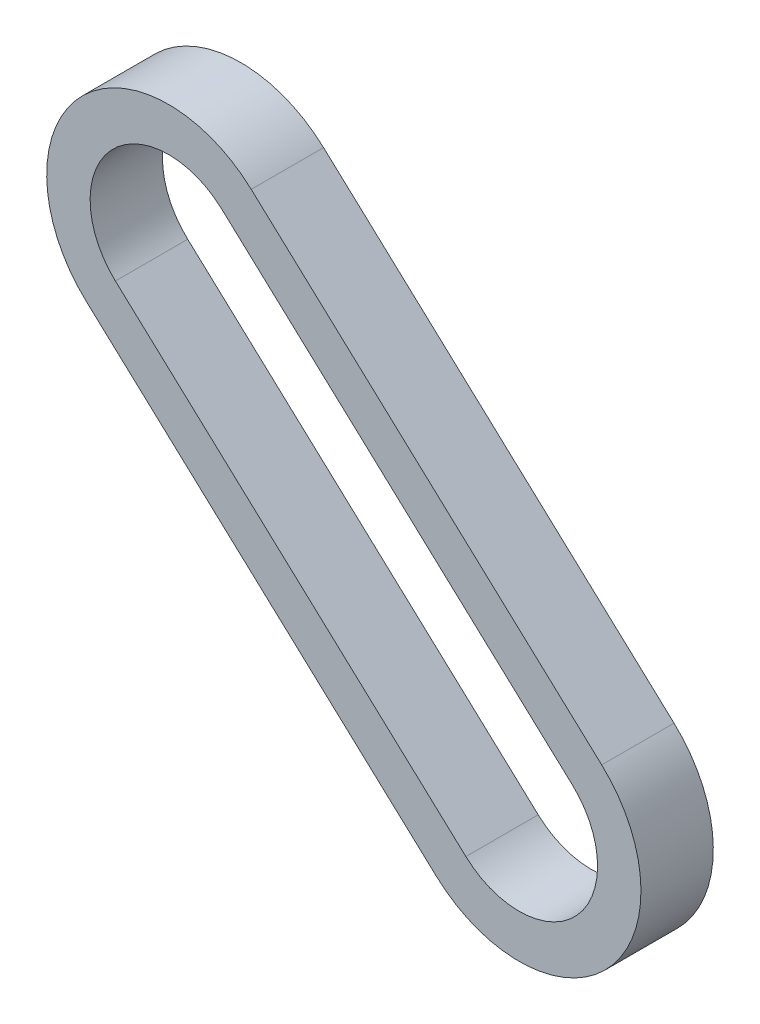
ISO-10303-21;
HEADER;
FILE_DESCRIPTION(('STEP AP214'),'2;1');
FILE_NAME('part.step','',(''),(''),'','','');
FILE_SCHEMA(('AUTOMOTIVE_DESIGN { 1 0 10303 214 1 1 1 1 }'));
ENDSEC;
DATA;
#1=APPLICATION_CONTEXT('core data for automotive mechanical design processes');
#2=APPLICATION_PROTOCOL_DEFINITION('international standard','automotive_design',2000,#1);
#3=PRODUCT_CONTEXT('',#1,'mechanical');
#4=PRODUCT('Part','Part','',(#3));
#5=PRODUCT_RELATED_PRODUCT_CATEGORY('part','',(#4));
#6=PRODUCT_DEFINITION_FORMATION('','',#4);
#7=PRODUCT_DEFINITION_CONTEXT('part definition',#1,'design');
#8=PRODUCT_DEFINITION('design','',#6,#7);
#9=PRODUCT_DEFINITION_SHAPE('','',#8);
#10=(LENGTH_UNIT() NAMED_UNIT(*) SI_UNIT(.MILLI.,.METRE.));
#11=(NAMED_UNIT(*) PLANE_ANGLE_UNIT() SI_UNIT($,.RADIAN.));
#12=(NAMED_UNIT(*) SI_UNIT($,.STERADIAN.) SOLID_ANGLE_UNIT());
#13=UNCERTAINTY_MEASURE_WITH_UNIT(LENGTH_MEASURE(1.E-05),#10,'distance_accuracy_value','');
#14=(GEOMETRIC_REPRESENTATION_CONTEXT(3) GLOBAL_UNCERTAINTY_ASSIGNED_CONTEXT((#13)) GLOBAL_UNIT_ASSIGNED_CONTEXT((#10,
#11,#12)) REPRESENTATION_CONTEXT('',''));
#15=CARTESIAN_POINT('',(0.,0.,0.));
#16=DIRECTION('',(0.,0.,1.));
#17=DIRECTION('',(1.,0.,0.));
#18=AXIS2_PLACEMENT_3D('',#15,#16,#17);
#19=CARTESIAN_POINT('',(7.48752404025904,-6.94681154311487,10.));
#20=DIRECTION('',(0.,0.,-1.));
#21=DIRECTION('',(-1.,0.,0.));
#22=AXIS2_PLACEMENT_3D('',#19,#20,#21);
#23=PLANE('',#22);
#24=CARTESIAN_POINT('',(7.48752404025904,-6.94681154311487,10.));
#25=DIRECTION('',(0.,0.,-1.));
#26=DIRECTION('',(-1.,0.,0.));
#27=AXIS2_PLACEMENT_3D('',#24,#25,#26);
#28=CIRCLE('',#27,16.85);
#29=CARTESIAN_POINT('',(-3.9353253675517,-19.3339424218324,10.));
#30=VERTEX_POINT('',#29);
#31=CARTESIAN_POINT('',(18.9103734480698,5.44031933560267,10.));
#32=VERTEX_POINT('',#31);
#33=EDGE_CURVE('E162',#30,#32,#28,.F.);
#34=ORIENTED_EDGE('',*,*,#33,.T.);
#35=DIRECTION('',(-0.73514129844021,0.677913911442774,0.));
#36=VECTOR('',#35,1.);
#37=CARTESIAN_POINT('',(18.9103734480698,5.44031933560268,10.));
#38=LINE('',#37,#36);
#39=CARTESIAN_POINT('',(-29.5455240434988,50.1241468809694,10.));
#40=VERTEX_POINT('',#39);
#41=EDGE_CURVE('E165',#32,#40,#38,.T.);
#42=ORIENTED_EDGE('',*,*,#41,.T.);
#43=CARTESIAN_POINT('',(-40.9683734513096,37.7370160022519,10.));
#44=DIRECTION('',(0.,0.,-1.));
#45=DIRECTION('',(-1.,0.,0.));
#46=AXIS2_PLACEMENT_3D('',#43,#44,#45);
#47=CIRCLE('',#46,16.85);
#48=CARTESIAN_POINT('',(-52.3912228591203,25.3498851235344,10.));
#49=VERTEX_POINT('',#48);
#50=EDGE_CURVE('E168',#40,#49,#47,.F.);
#51=ORIENTED_EDGE('',*,*,#50,.T.);
#52=DIRECTION('',(0.73514129844021,-0.677913911442774,0.));
#53=VECTOR('',#52,1.);
#54=CARTESIAN_POINT('',(-3.93532536755171,-19.3339424218324,10.));
#55=LINE('',#54,#53);
#56=EDGE_CURVE('E170',#49,#30,#55,.T.);
#57=ORIENTED_EDGE('',*,*,#56,.T.);
#58=EDGE_LOOP('',(#34,#42,#51,#57));
#59=FACE_BOUND('',#58,.T.);
#60=CARTESIAN_POINT('',(7.48752404025904,-6.94681154311487,10.));
#61=DIRECTION('',(0.,0.,1.));
#62=DIRECTION('',(-1.,0.,0.));
#63=AXIS2_PLACEMENT_3D('',#60,#61,#62);
#64=CIRCLE('',#63,10.85);
#65=CARTESIAN_POINT('',(0.13215810110494,-14.9230946311912,10.));
#66=VERTEX_POINT('',#65);
#67=CARTESIAN_POINT('',(14.8428899794131,1.02947154496141,10.));
#68=VERTEX_POINT('',#67);
#69=EDGE_CURVE('E126',#66,#68,#64,.T.);
#70=ORIENTED_EDGE('',*,*,#69,.F.);
#71=DIRECTION('',(0.73514129844021,-0.677913911442774,0.));
#72=VECTOR('',#71,1.);
#73=CARTESIAN_POINT('',(0.13215810110494,-14.9230946311912,10.));
#74=LINE('',#73,#72);
#75=CARTESIAN_POINT('',(-48.3237393904637,29.7607329141756,10.));
#76=VERTEX_POINT('',#75);
#77=EDGE_CURVE('E148',#76,#66,#74,.T.);
#78=ORIENTED_EDGE('',*,*,#77,.F.);
#79=CARTESIAN_POINT('',(-40.9683734513096,37.7370160022519,10.));
#80=DIRECTION('',(0.,0.,1.));
#81=DIRECTION('',(-1.,0.,0.));
#82=AXIS2_PLACEMENT_3D('',#79,#80,#81);
#83=CIRCLE('',#82,10.85);
#84=CARTESIAN_POINT('',(-33.6130075121555,45.7132990903282,10.));
#85=VERTEX_POINT('',#84);
#86=EDGE_CURVE('E146',#85,#76,#83,.T.);
#87=ORIENTED_EDGE('',*,*,#86,.F.);
#88=DIRECTION('',(-0.73514129844021,0.677913911442774,0.));
#89=VECTOR('',#88,1.);
#90=CARTESIAN_POINT('',(-33.6130075121555,45.7132990903282,10.));
#91=LINE('',#90,#89);
#92=EDGE_CURVE('E134',#68,#85,#91,.T.);
#93=ORIENTED_EDGE('',*,*,#92,.F.);
#94=EDGE_LOOP('',(#70,#78,#87,#93));
#95=FACE_BOUND('',#94,.T.);
#96=ADVANCED_FACE('F61',(#59,#95),#23,.F.);
#97=CARTESIAN_POINT('',(7.48752404025904,-6.94681154311487,0.));
#98=DIRECTION('',(0.,0.,-1.));
#99=DIRECTION('',(-1.,0.,0.));
#100=AXIS2_PLACEMENT_3D('',#97,#98,#99);
#101=PLANE('',#100);
#102=CARTESIAN_POINT('',(7.48752404025904,-6.94681154311487,0.));
#103=DIRECTION('',(0.,0.,-1.));
#104=DIRECTION('',(-1.,0.,0.));
#105=AXIS2_PLACEMENT_3D('',#102,#103,#104);
#106=CIRCLE('',#105,16.85);
#107=CARTESIAN_POINT('',(-3.9353253675517,-19.3339424218324,0.));
#108=VERTEX_POINT('',#107);
#109=CARTESIAN_POINT('',(18.9103734480698,5.44031933560267,0.));
#110=VERTEX_POINT('',#109);
#111=EDGE_CURVE('E142',#108,#110,#106,.F.);
#112=ORIENTED_EDGE('',*,*,#111,.F.);
#113=DIRECTION('',(0.73514129844021,-0.677913911442774,0.));
#114=VECTOR('',#113,1.);
#115=CARTESIAN_POINT('',(-3.93532536755171,-19.3339424218324,0.));
#116=LINE('',#115,#114);
#117=CARTESIAN_POINT('',(-52.3912228591203,25.3498851235344,0.));
#118=VERTEX_POINT('',#117);
#119=EDGE_CURVE('E166',#118,#108,#116,.T.);
#120=ORIENTED_EDGE('',*,*,#119,.F.);
#121=CARTESIAN_POINT('',(-40.9683734513096,37.7370160022519,0.));
#122=DIRECTION('',(0.,0.,-1.));
#123=DIRECTION('',(-1.,0.,0.));
#124=AXIS2_PLACEMENT_3D('',#121,#122,#123);
#125=CIRCLE('',#124,16.85);
#126=CARTESIAN_POINT('',(-29.5455240434988,50.1241468809694,0.));
#127=VERTEX_POINT('',#126);
#128=EDGE_CURVE('E177',#127,#118,#125,.F.);
#129=ORIENTED_EDGE('',*,*,#128,.F.);
#130=DIRECTION('',(-0.73514129844021,0.677913911442774,0.));
#131=VECTOR('',#130,1.);
#132=CARTESIAN_POINT('',(18.9103734480698,5.44031933560268,0.));
#133=LINE('',#132,#131);
#134=EDGE_CURVE('E175',#110,#127,#133,.T.);
#135=ORIENTED_EDGE('',*,*,#134,.F.);
#136=EDGE_LOOP('',(#112,#120,#129,#135));
#137=FACE_BOUND('',#136,.T.);
#138=DIRECTION('',(0.73514129844021,-0.677913911442774,0.));
#139=VECTOR('',#138,1.);
#140=CARTESIAN_POINT('',(0.13215810110494,-14.9230946311912,0.));
#141=LINE('',#140,#139);
#142=CARTESIAN_POINT('',(-48.3237393904637,29.7607329141756,0.));
#143=VERTEX_POINT('',#142);
#144=CARTESIAN_POINT('',(0.13215810110494,-14.9230946311912,0.));
#145=VERTEX_POINT('',#144);
#146=EDGE_CURVE('E135',#143,#145,#141,.T.);
#147=ORIENTED_EDGE('',*,*,#146,.T.);
#148=CARTESIAN_POINT('',(7.48752404025904,-6.94681154311487,0.));
#149=DIRECTION('',(0.,0.,1.));
#150=DIRECTION('',(-1.,0.,0.));
#151=AXIS2_PLACEMENT_3D('',#148,#149,#150);
#152=CIRCLE('',#151,10.85);
#153=CARTESIAN_POINT('',(14.8428899794131,1.02947154496141,0.));
#154=VERTEX_POINT('',#153);
#155=EDGE_CURVE('E84',#145,#154,#152,.T.);
#156=ORIENTED_EDGE('',*,*,#155,.T.);
#157=DIRECTION('',(-0.73514129844021,0.677913911442774,0.));
#158=VECTOR('',#157,1.);
#159=CARTESIAN_POINT('',(-33.6130075121555,45.7132990903282,0.));
#160=LINE('',#159,#158);
#161=CARTESIAN_POINT('',(-33.6130075121555,45.7132990903282,0.));
#162=VERTEX_POINT('',#161);
#163=EDGE_CURVE('E141',#154,#162,#160,.T.);
#164=ORIENTED_EDGE('',*,*,#163,.T.);
#165=CARTESIAN_POINT('',(-40.9683734513096,37.7370160022519,0.));
#166=DIRECTION('',(0.,0.,1.));
#167=DIRECTION('',(-1.,0.,0.));
#168=AXIS2_PLACEMENT_3D('',#165,#166,#167);
#169=CIRCLE('',#168,10.85);
#170=EDGE_CURVE('E154',#162,#143,#169,.T.);
#171=ORIENTED_EDGE('',*,*,#170,.T.);
#172=EDGE_LOOP('',(#147,#156,#164,#171));
#173=FACE_BOUND('',#172,.T.);
#174=ADVANCED_FACE('F195',(#137,#173),#101,.T.);
#175=CARTESIAN_POINT('',(7.48752404025904,-6.94681154311487,10.));
#176=DIRECTION('',(0.,0.,-1.));
#177=DIRECTION('',(-1.,0.,0.));
#178=AXIS2_PLACEMENT_3D('',#175,#176,#177);
#179=CYLINDRICAL_SURFACE('',#178,16.85);
#180=ORIENTED_EDGE('',*,*,#111,.T.);
#181=DIRECTION('',(0.,0.,-1.));
#182=VECTOR('',#181,1.);
#183=CARTESIAN_POINT('',(18.9103734480698,5.44031933560267,10.));
#184=LINE('',#183,#182);
#185=EDGE_CURVE('E12',#32,#110,#184,.T.);
#186=ORIENTED_EDGE('',*,*,#185,.F.);
#187=ORIENTED_EDGE('',*,*,#33,.F.);
#188=DIRECTION('',(0.,0.,-1.));
#189=VECTOR('',#188,1.);
#190=CARTESIAN_POINT('',(-3.9353253675517,-19.3339424218324,10.));
#191=LINE('',#190,#189);
#192=EDGE_CURVE('E172',#30,#108,#191,.T.);
#193=ORIENTED_EDGE('',*,*,#192,.T.);
#194=EDGE_LOOP('',(#180,#186,#187,#193));
#195=FACE_BOUND('',#194,.T.);
#196=ADVANCED_FACE('F63',(#195),#179,.T.);
#197=CARTESIAN_POINT('',(18.9103734480698,5.44031933560268,10.));
#198=DIRECTION('',(-0.677913911442774,-0.73514129844021,0.));
#199=DIRECTION('',(0.73514129844021,-0.677913911442774,0.));
#200=AXIS2_PLACEMENT_3D('',#197,#198,#199);
#201=PLANE('',#200);
#202=ORIENTED_EDGE('',*,*,#134,.T.);
#203=DIRECTION('',(0.,0.,-1.));
#204=VECTOR('',#203,1.);
#205=CARTESIAN_POINT('',(-29.5455240434988,50.1241468809694,10.));
#206=LINE('',#205,#204);
#207=EDGE_CURVE('E69',#40,#127,#206,.T.);
#208=ORIENTED_EDGE('',*,*,#207,.F.);
#209=ORIENTED_EDGE('',*,*,#41,.F.);
#210=ORIENTED_EDGE('',*,*,#185,.T.);
#211=EDGE_LOOP('',(#202,#208,#209,#210));
#212=FACE_BOUND('',#211,.T.);
#213=ADVANCED_FACE('F205',(#212),#201,.F.);
#214=CARTESIAN_POINT('',(-40.9683734513096,37.7370160022519,10.));
#215=DIRECTION('',(0.,0.,-1.));
#216=DIRECTION('',(-1.,0.,0.));
#217=AXIS2_PLACEMENT_3D('',#214,#215,#216);
#218=CYLINDRICAL_SURFACE('',#217,16.85);
#219=ORIENTED_EDGE('',*,*,#128,.T.);
#220=DIRECTION('',(0.,0.,-1.));
#221=VECTOR('',#220,1.);
#222=CARTESIAN_POINT('',(-52.3912228591203,25.3498851235344,10.));
#223=LINE('',#222,#221);
#224=EDGE_CURVE('E182',#49,#118,#223,.T.);
#225=ORIENTED_EDGE('',*,*,#224,.F.);
#226=ORIENTED_EDGE('',*,*,#50,.F.);
#227=ORIENTED_EDGE('',*,*,#207,.T.);
#228=EDGE_LOOP('',(#219,#225,#226,#227));
#229=FACE_BOUND('',#228,.T.);
#230=ADVANCED_FACE('F189',(#229),#218,.T.);
#231=CARTESIAN_POINT('',(-3.93532536755171,-19.3339424218324,10.));
#232=DIRECTION('',(0.677913911442774,0.73514129844021,0.));
#233=DIRECTION('',(-0.73514129844021,0.677913911442774,0.));
#234=AXIS2_PLACEMENT_3D('',#231,#232,#233);
#235=PLANE('',#234);
#236=ORIENTED_EDGE('',*,*,#119,.T.);
#237=ORIENTED_EDGE('',*,*,#192,.F.);
#238=ORIENTED_EDGE('',*,*,#56,.F.);
#239=ORIENTED_EDGE('',*,*,#224,.T.);
#240=EDGE_LOOP('',(#236,#237,#238,#239));
#241=FACE_BOUND('',#240,.T.);
#242=ADVANCED_FACE('F199',(#241),#235,.F.);
#243=CARTESIAN_POINT('',(7.48752404025904,-6.94681154311487,10.));
#244=DIRECTION('',(0.,0.,-1.));
#245=DIRECTION('',(-1.,0.,0.));
#246=AXIS2_PLACEMENT_3D('',#243,#244,#245);
#247=CYLINDRICAL_SURFACE('',#246,10.85);
#248=ORIENTED_EDGE('',*,*,#155,.F.);
#249=DIRECTION('',(0.,0.,-1.));
#250=VECTOR('',#249,1.);
#251=CARTESIAN_POINT('',(0.13215810110494,-14.9230946311912,10.));
#252=LINE('',#251,#250);
#253=EDGE_CURVE('E130',#66,#145,#252,.T.);
#254=ORIENTED_EDGE('',*,*,#253,.F.);
#255=ORIENTED_EDGE('',*,*,#69,.T.);
#256=DIRECTION('',(0.,0.,-1.));
#257=VECTOR('',#256,1.);
#258=CARTESIAN_POINT('',(14.8428899794131,1.02947154496141,10.));
#259=LINE('',#258,#257);
#260=EDGE_CURVE('E129',#68,#154,#259,.T.);
#261=ORIENTED_EDGE('',*,*,#260,.T.);
#262=EDGE_LOOP('',(#248,#254,#255,#261));
#263=FACE_BOUND('',#262,.T.);
#264=ADVANCED_FACE('F128',(#263),#247,.F.);
#265=CARTESIAN_POINT('',(-33.6130075121555,45.7132990903282,10.));
#266=DIRECTION('',(-0.677913911442774,-0.73514129844021,0.));
#267=DIRECTION('',(0.73514129844021,-0.677913911442774,0.));
#268=AXIS2_PLACEMENT_3D('',#265,#266,#267);
#269=PLANE('',#268);
#270=ORIENTED_EDGE('',*,*,#163,.F.);
#271=ORIENTED_EDGE('',*,*,#260,.F.);
#272=ORIENTED_EDGE('',*,*,#92,.T.);
#273=DIRECTION('',(0.,0.,-1.));
#274=VECTOR('',#273,1.);
#275=CARTESIAN_POINT('',(-33.6130075121555,45.7132990903282,10.));
#276=LINE('',#275,#274);
#277=EDGE_CURVE('E143',#85,#162,#276,.T.);
#278=ORIENTED_EDGE('',*,*,#277,.T.);
#279=EDGE_LOOP('',(#270,#271,#272,#278));
#280=FACE_BOUND('',#279,.T.);
#281=ADVANCED_FACE('F138',(#280),#269,.T.);
#282=CARTESIAN_POINT('',(-40.9683734513096,37.7370160022519,10.));
#283=DIRECTION('',(0.,0.,-1.));
#284=DIRECTION('',(-1.,0.,0.));
#285=AXIS2_PLACEMENT_3D('',#282,#283,#284);
#286=CYLINDRICAL_SURFACE('',#285,10.85);
#287=ORIENTED_EDGE('',*,*,#170,.F.);
#288=ORIENTED_EDGE('',*,*,#277,.F.);
#289=ORIENTED_EDGE('',*,*,#86,.T.);
#290=DIRECTION('',(0.,0.,-1.));
#291=VECTOR('',#290,1.);
#292=CARTESIAN_POINT('',(-48.3237393904637,29.7607329141756,10.));
#293=LINE('',#292,#291);
#294=EDGE_CURVE('E76',#76,#143,#293,.T.);
#295=ORIENTED_EDGE('',*,*,#294,.T.);
#296=EDGE_LOOP('',(#287,#288,#289,#295));
#297=FACE_BOUND('',#296,.T.);
#298=ADVANCED_FACE('F228',(#297),#286,.F.);
#299=CARTESIAN_POINT('',(0.13215810110494,-14.9230946311912,10.));
#300=DIRECTION('',(0.677913911442774,0.73514129844021,0.));
#301=DIRECTION('',(-0.73514129844021,0.677913911442774,0.));
#302=AXIS2_PLACEMENT_3D('',#299,#300,#301);
#303=PLANE('',#302);
#304=ORIENTED_EDGE('',*,*,#146,.F.);
#305=ORIENTED_EDGE('',*,*,#294,.F.);
#306=ORIENTED_EDGE('',*,*,#77,.T.);
#307=ORIENTED_EDGE('',*,*,#253,.T.);
#308=EDGE_LOOP('',(#304,#305,#306,#307));
#309=FACE_BOUND('',#308,.T.);
#310=ADVANCED_FACE('F232',(#309),#303,.T.);
#311=CLOSED_SHELL('',(#96,#174,#196,#213,#230,#242,#264,#281,#298,#310));
#312=MANIFOLD_SOLID_BREP('B2',#311);
#313=ADVANCED_BREP_SHAPE_REPRESENTATION('',(#18,#312),#14);
#314=SHAPE_DEFINITION_REPRESENTATION(#9,#313);
ENDSEC;
END-ISO-10303-21;
